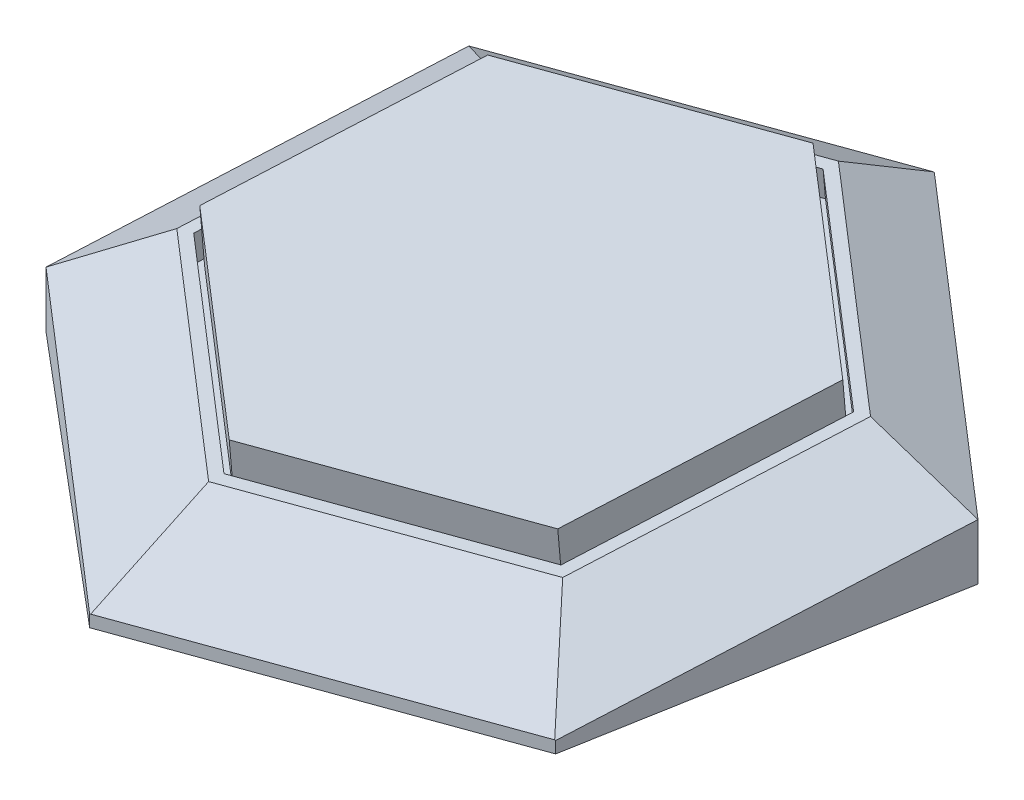
ISO-10303-21;
HEADER;
FILE_DESCRIPTION(('STEP AP214'),'2;1');
FILE_NAME('part.step','',(''),(''),'','','');
FILE_SCHEMA(('AUTOMOTIVE_DESIGN { 1 0 10303 214 1 1 1 1 }'));
ENDSEC;
DATA;
#1=APPLICATION_CONTEXT('core data for automotive mechanical design processes');
#2=APPLICATION_PROTOCOL_DEFINITION('international standard','automotive_design',2000,#1);
#3=PRODUCT_CONTEXT('',#1,'mechanical');
#4=PRODUCT('Part','Part','',(#3));
#5=PRODUCT_RELATED_PRODUCT_CATEGORY('part','',(#4));
#6=PRODUCT_DEFINITION_FORMATION('','',#4);
#7=PRODUCT_DEFINITION_CONTEXT('part definition',#1,'design');
#8=PRODUCT_DEFINITION('design','',#6,#7);
#9=PRODUCT_DEFINITION_SHAPE('','',#8);
#10=(LENGTH_UNIT() NAMED_UNIT(*) SI_UNIT(.MILLI.,.METRE.));
#11=(NAMED_UNIT(*) PLANE_ANGLE_UNIT() SI_UNIT($,.RADIAN.));
#12=(NAMED_UNIT(*) SI_UNIT($,.STERADIAN.) SOLID_ANGLE_UNIT());
#13=UNCERTAINTY_MEASURE_WITH_UNIT(LENGTH_MEASURE(1.E-05),#10,'distance_accuracy_value','');
#14=(GEOMETRIC_REPRESENTATION_CONTEXT(3) GLOBAL_UNCERTAINTY_ASSIGNED_CONTEXT((#13)) GLOBAL_UNIT_ASSIGNED_CONTEXT((#10,
#11,#12)) REPRESENTATION_CONTEXT('',''));
#15=CARTESIAN_POINT('',(0.,0.,0.));
#16=DIRECTION('',(0.,0.,1.));
#17=DIRECTION('',(1.,0.,0.));
#18=AXIS2_PLACEMENT_3D('',#15,#16,#17);
#19=CARTESIAN_POINT('',(1.01675946226807,21.3458509470988,2.8138595291201));
#20=DIRECTION('',(0.0471715385952953,0.990319410998527,0.130546199278579));
#21=DIRECTION('',(0.,-0.130691684821704,0.991423059807701));
#22=AXIS2_PLACEMENT_3D('',#19,#20,#21);
#23=PLANE('',#22);
#24=DIRECTION('',(-0.758976971156788,0.120501210175524,-0.639869842702329));
#25=VECTOR('',#24,1.);
#26=CARTESIAN_POINT('',(6.28894349600142,13.3301489193183,61.7156760565683));
#27=LINE('',#26,#25);
#28=CARTESIAN_POINT('',(6.28894349600142,13.3301489193183,61.7156760565683));
#29=VERTEX_POINT('',#28);
#30=CARTESIAN_POINT('',(-27.6831230585581,18.7238239418272,33.0748849540297));
#31=VERTEX_POINT('',#30);
#32=EDGE_CURVE('E225',#29,#31,#27,.T.);
#33=ORIENTED_EDGE('',*,*,#32,.T.);
#34=DIRECTION('',(-0.940485170338627,0.,0.339834730969518));
#35=VECTOR('',#34,1.);
#36=CARTESIAN_POINT('',(-27.6831230585581,18.7238239418272,33.0748849540297));
#37=LINE('',#36,#35);
#38=CARTESIAN_POINT('',(-70.4786896021807,18.7238239418273,48.5386267563631));
#39=VERTEX_POINT('',#38);
#40=EDGE_CURVE('E228',#31,#39,#37,.T.);
#41=ORIENTED_EDGE('',*,*,#40,.T.);
#42=DIRECTION('',(-0.174655053317376,-0.120501210175521,0.977228259260312));
#43=VECTOR('',#42,1.);
#44=CARTESIAN_POINT('',(-70.4786896021807,18.7238239418273,48.5386267563631));
#45=LINE('',#44,#43);
#46=CARTESIAN_POINT('',(-78.2963090041827,13.3301489193184,92.2796949629368));
#47=VERTEX_POINT('',#46);
#48=EDGE_CURVE('E232',#39,#47,#45,.T.);
#49=ORIENTED_EDGE('',*,*,#48,.T.);
#50=DIRECTION('',(0.758976971156787,-0.120501210175524,0.639869842702329));
#51=VECTOR('',#50,1.);
#52=CARTESIAN_POINT('',(-78.2963090041827,13.3301489193184,92.2796949629368));
#53=LINE('',#52,#51);
#54=CARTESIAN_POINT('',(-44.6526328361873,7.9886117619817,120.643630359728));
#55=VERTEX_POINT('',#54);
#56=EDGE_CURVE('E235',#47,#55,#53,.T.);
#57=ORIENTED_EDGE('',*,*,#56,.T.);
#58=DIRECTION('',(0.940485170338627,0.,-0.339834730969518));
#59=VECTOR('',#58,1.);
#60=CARTESIAN_POINT('',(-44.6526328361873,7.9886117619817,120.643630359728));
#61=LINE('',#60,#59);
#62=CARTESIAN_POINT('',(-1.45310702492267,7.9886117619816,105.033921993145));
#63=VERTEX_POINT('',#62);
#64=EDGE_CURVE('E238',#55,#63,#61,.T.);
#65=ORIENTED_EDGE('',*,*,#64,.T.);
#66=DIRECTION('',(0.174655053317376,0.120501210175521,-0.977228259260312));
#67=VECTOR('',#66,1.);
#68=CARTESIAN_POINT('',(-1.45310702492267,7.9886117619816,105.033921993145));
#69=LINE('',#68,#67);
#70=EDGE_CURVE('E241',#63,#29,#69,.T.);
#71=ORIENTED_EDGE('',*,*,#70,.T.);
#72=EDGE_LOOP('',(#33,#41,#49,#57,#65,#71));
#73=FACE_BOUND('',#72,.T.);
#74=DIRECTION('',(-0.758976971156788,0.120501210175523,-0.639869842702329));
#75=VECTOR('',#74,1.);
#76=CARTESIAN_POINT('',(5.20558342776289,13.3301489193183,62.1071371757271));
#77=LINE('',#76,#75);
#78=CARTESIAN_POINT('',(5.20558342776289,13.3301489193183,62.1071371757271));
#79=VERTEX_POINT('',#78);
#80=CARTESIAN_POINT('',(-27.8922052868092,18.5850166502337,34.2034224868486));
#81=VERTEX_POINT('',#80);
#82=EDGE_CURVE('E635',#79,#81,#77,.T.);
#83=ORIENTED_EDGE('',*,*,#82,.F.);
#84=DIRECTION('',(0.174655053317376,0.120501210175521,-0.977228259260312));
#85=VECTOR('',#84,1.);
#86=CARTESIAN_POINT('',(-2.3352791143949,8.12741905357513,104.299698086079));
#87=LINE('',#86,#85);
#88=CARTESIAN_POINT('',(-2.3352791143949,8.12741905357513,104.299698086079));
#89=VERTEX_POINT('',#88);
#90=EDGE_CURVE('E216',#89,#79,#87,.T.);
#91=ORIENTED_EDGE('',*,*,#90,.F.);
#92=DIRECTION('',(0.940485170338627,0.,-0.339834730969518));
#93=VECTOR('',#92,1.);
#94=CARTESIAN_POINT('',(-44.4435506079362,8.12741905357523,119.515092826909));
#95=LINE('',#94,#93);
#96=CARTESIAN_POINT('',(-44.4435506079362,8.12741905357523,119.515092826909));
#97=VERTEX_POINT('',#96);
#98=EDGE_CURVE('E212',#97,#89,#95,.T.);
#99=ORIENTED_EDGE('',*,*,#98,.F.);
#100=DIRECTION('',(0.758976971156787,-0.120501210175524,0.639869842702329));
#101=VECTOR('',#100,1.);
#102=CARTESIAN_POINT('',(-77.2129489359442,13.3301489193185,91.888233843778));
#103=LINE('',#102,#101);
#104=CARTESIAN_POINT('',(-77.2129489359442,13.3301489193185,91.888233843778));
#105=VERTEX_POINT('',#104);
#106=EDGE_CURVE('E631',#105,#97,#103,.T.);
#107=ORIENTED_EDGE('',*,*,#106,.F.);
#108=DIRECTION('',(-0.174655053317376,-0.120501210175521,0.977228259260312));
#109=VECTOR('',#108,1.);
#110=CARTESIAN_POINT('',(-69.5965175127085,18.5850166502338,49.2728506634293));
#111=LINE('',#110,#109);
#112=CARTESIAN_POINT('',(-69.5965175127085,18.5850166502338,49.2728506634293));
#113=VERTEX_POINT('',#112);
#114=EDGE_CURVE('E643',#113,#105,#111,.T.);
#115=ORIENTED_EDGE('',*,*,#114,.F.);
#116=DIRECTION('',(-0.940485170338627,0.,0.339834730969518));
#117=VECTOR('',#116,1.);
#118=CARTESIAN_POINT('',(-27.8922052868092,18.5850166502337,34.2034224868486));
#119=LINE('',#118,#117);
#120=EDGE_CURVE('E637',#81,#113,#119,.T.);
#121=ORIENTED_EDGE('',*,*,#120,.F.);
#122=EDGE_LOOP('',(#83,#91,#99,#107,#115,#121));
#123=FACE_BOUND('',#122,.T.);
#124=ADVANCED_FACE('F36',(#73,#123),#23,.T.);
#125=CARTESIAN_POINT('',(1.25261715524454,26.2974480020914,3.46659052551318));
#126=DIRECTION('',(0.0471715385952953,0.990319410998527,0.130546199278579));
#127=DIRECTION('',(0.,-0.130691684821704,0.991423059807701));
#128=AXIS2_PLACEMENT_3D('',#125,#126,#127);
#129=PLANE('',#128);
#130=DIRECTION('',(-0.758976971156788,0.120501210175524,-0.639869842702329));
#131=VECTOR('',#130,1.);
#132=CARTESIAN_POINT('',(6.5248011889779,18.2817459743109,62.3684070529612));
#133=LINE('',#132,#131);
#134=CARTESIAN_POINT('',(6.5248011889779,18.2817459743109,62.3684070529612));
#135=VERTEX_POINT('',#134);
#136=CARTESIAN_POINT('',(-27.4472653655817,23.6754209968198,33.7276159504226));
#137=VERTEX_POINT('',#136);
#138=EDGE_CURVE('E62',#135,#137,#133,.T.);
#139=ORIENTED_EDGE('',*,*,#138,.F.);
#140=DIRECTION('',(0.174655053317376,0.120501210175521,-0.977228259260312));
#141=VECTOR('',#140,1.);
#142=CARTESIAN_POINT('',(-1.21724933194619,12.9402088169742,105.686652989538));
#143=LINE('',#142,#141);
#144=CARTESIAN_POINT('',(-1.21724933194619,12.9402088169742,105.686652989538));
#145=VERTEX_POINT('',#144);
#146=EDGE_CURVE('E229',#145,#135,#143,.T.);
#147=ORIENTED_EDGE('',*,*,#146,.F.);
#148=DIRECTION('',(0.940485170338627,0.,-0.339834730969518));
#149=VECTOR('',#148,1.);
#150=CARTESIAN_POINT('',(-44.4167751432108,12.9402088169743,121.296361356121));
#151=LINE('',#150,#149);
#152=CARTESIAN_POINT('',(-44.4167751432108,12.9402088169743,121.296361356121));
#153=VERTEX_POINT('',#152);
#154=EDGE_CURVE('E253',#153,#145,#151,.T.);
#155=ORIENTED_EDGE('',*,*,#154,.F.);
#156=DIRECTION('',(0.758976971156787,-0.120501210175524,0.639869842702329));
#157=VECTOR('',#156,1.);
#158=CARTESIAN_POINT('',(-78.0604513112063,18.2817459743111,92.9324259593297));
#159=LINE('',#158,#157);
#160=CARTESIAN_POINT('',(-78.0604513112063,18.2817459743111,92.9324259593297));
#161=VERTEX_POINT('',#160);
#162=EDGE_CURVE('E250',#161,#153,#159,.T.);
#163=ORIENTED_EDGE('',*,*,#162,.F.);
#164=DIRECTION('',(-0.174655053317376,-0.120501210175521,0.977228259260312));
#165=VECTOR('',#164,1.);
#166=CARTESIAN_POINT('',(-70.2428319092042,23.6754209968199,49.1913577527559));
#167=LINE('',#166,#165);
#168=CARTESIAN_POINT('',(-70.2428319092042,23.6754209968199,49.1913577527559));
#169=VERTEX_POINT('',#168);
#170=EDGE_CURVE('E247',#169,#161,#167,.T.);
#171=ORIENTED_EDGE('',*,*,#170,.F.);
#172=DIRECTION('',(-0.940485170338627,0.,0.339834730969518));
#173=VECTOR('',#172,1.);
#174=CARTESIAN_POINT('',(-27.4472653655817,23.6754209968198,33.7276159504226));
#175=LINE('',#174,#173);
#176=EDGE_CURVE('E219',#137,#169,#175,.T.);
#177=ORIENTED_EDGE('',*,*,#176,.F.);
#178=EDGE_LOOP('',(#139,#147,#155,#163,#171,#177));
#179=FACE_BOUND('',#178,.T.);
#180=DIRECTION('',(-0.940485170338627,0.,0.339834730969518));
#181=VECTOR('',#180,1.);
#182=CARTESIAN_POINT('',(-79.3825536431262,23.953035580007,50.387927448992));
#183=LINE('',#182,#181);
#184=CARTESIAN_POINT('',(-27.0291009090795,23.9530355800069,31.4705408847847));
#185=VERTEX_POINT('',#184);
#186=CARTESIAN_POINT('',(-72.0071760881486,23.953035580007,47.7229099386234));
#187=VERTEX_POINT('',#186);
#188=EDGE_CURVE('E308',#185,#187,#183,.T.);
#189=ORIENTED_EDGE('',*,*,#188,.T.);
#190=DIRECTION('',(-0.174655053317376,-0.120501210175521,0.977228259260312));
#191=VECTOR('',#190,1.);
#192=CARTESIAN_POINT('',(-82.1534793575359,16.9527123740859,104.493407519664));
#193=LINE('',#192,#191);
#194=CARTESIAN_POINT('',(-80.2271714476833,18.2817459743111,93.7153481976471));
#195=VERTEX_POINT('',#194);
#196=EDGE_CURVE('E310',#187,#195,#193,.T.);
#197=ORIENTED_EDGE('',*,*,#196,.T.);
#198=DIRECTION('',(0.758976971156787,-0.120501210175524,0.639869842702329));
#199=VECTOR('',#198,1.);
#200=CARTESIAN_POINT('',(-35.5336964028465,11.1858550125024,131.395024832859));
#201=LINE('',#200,#199);
#202=CARTESIAN_POINT('',(-44.8349395997129,12.6625942337873,123.553436421759));
#203=VERTEX_POINT('',#202);
#204=EDGE_CURVE('E289',#195,#203,#201,.T.);
#205=ORIENTED_EDGE('',*,*,#204,.T.);
#206=DIRECTION('',(0.940485170338627,0.,-0.339834730969518));
#207=VECTOR('',#206,1.);
#208=CARTESIAN_POINT('',(7.72049276815488,12.6625942337872,104.563066575427));
#209=LINE('',#208,#207);
#210=CARTESIAN_POINT('',(0.547094846998261,12.6625942337872,107.155100803671));
#211=VERTEX_POINT('',#210);
#212=EDGE_CURVE('E302',#203,#211,#209,.T.);
#213=ORIENTED_EDGE('',*,*,#212,.T.);
#214=DIRECTION('',(0.174655053317376,0.120501210175521,-0.977228259260312));
#215=VECTOR('',#214,1.);
#216=CARTESIAN_POINT('',(9.58020661658568,18.8948839912902,56.6131214985718));
#217=LINE('',#216,#215);
#218=CARTESIAN_POINT('',(8.69152132545497,18.2817459743109,61.5854848146437));
#219=VERTEX_POINT('',#218);
#220=EDGE_CURVE('E304',#211,#219,#217,.T.);
#221=ORIENTED_EDGE('',*,*,#220,.T.);
#222=DIRECTION('',(-0.758976971156788,0.120501210175524,-0.639869842702329));
#223=VECTOR('',#222,1.);
#224=CARTESIAN_POINT('',(-31.4928848009448,24.6617413528737,27.7072637297589));
#225=LINE('',#224,#223);
#226=EDGE_CURVE('E306',#219,#185,#225,.T.);
#227=ORIENTED_EDGE('',*,*,#226,.T.);
#228=EDGE_LOOP('',(#189,#197,#205,#213,#221,#227));
#229=FACE_BOUND('',#228,.T.);
#230=ADVANCED_FACE('F386',(#179,#229),#129,.T.);
#231=CARTESIAN_POINT('',(-45.7897550663395,80.,143.355261310093));
#232=DIRECTION('',(-0.339834730969518,0.,-0.940485170338627));
#233=DIRECTION('',(-0.940485170338627,0.,0.339834730969518));
#234=AXIS2_PLACEMENT_3D('',#231,#232,#233);
#235=PLANE('',#234);
#236=DIRECTION('',(0.,-1.,0.));
#237=VECTOR('',#236,1.);
#238=CARTESIAN_POINT('',(13.9390752226848,80.,121.772857235517));
#239=LINE('',#238,#237);
#240=CARTESIAN_POINT('',(13.9390752226848,2.03902973123853,121.772857235517));
#241=VERTEX_POINT('',#240);
#242=CARTESIAN_POINT('',(13.9390752226848,0.,121.772857235517));
#243=VERTEX_POINT('',#242);
#244=EDGE_CURVE('E290',#241,#243,#239,.T.);
#245=ORIENTED_EDGE('',*,*,#244,.F.);
#246=DIRECTION('',(-0.859893785648814,0.405017996400494,0.310713855491319));
#247=VECTOR('',#246,1.);
#248=CARTESIAN_POINT('',(40.1471587044077,-10.3052221268618,112.302833379605));
#249=LINE('',#248,#247);
#250=CARTESIAN_POINT('',(13.8144015618452,2.09775218877911,121.817906792199));
#251=VERTEX_POINT('',#250);
#252=EDGE_CURVE('E46',#241,#251,#249,.T.);
#253=ORIENTED_EDGE('',*,*,#252,.T.);
#254=DIRECTION('',(-0.940485170338627,0.,0.339834730969518));
#255=VECTOR('',#254,1.);
#256=CARTESIAN_POINT('',(-45.7897550663395,2.09775218877926,143.355261310093));
#257=LINE('',#256,#255);
#258=CARTESIAN_POINT('',(-45.6650814054999,2.09775218877926,143.31021175341));
#259=VERTEX_POINT('',#258);
#260=EDGE_CURVE('E328',#251,#259,#257,.T.);
#261=ORIENTED_EDGE('',*,*,#260,.T.);
#262=DIRECTION('',(-0.859893785648815,-0.405017996400492,0.31071385549132));
#263=VECTOR('',#262,1.);
#264=CARTESIAN_POINT('',(-51.2442798115745,-0.53010231797725,145.326198234804));
#265=LINE('',#264,#263);
#266=CARTESIAN_POINT('',(-45.7897550663395,2.0390297312387,143.355261310093));
#267=VERTEX_POINT('',#266);
#268=EDGE_CURVE('E326',#259,#267,#265,.T.);
#269=ORIENTED_EDGE('',*,*,#268,.T.);
#270=DIRECTION('',(0.,-1.,0.));
#271=VECTOR('',#270,1.);
#272=CARTESIAN_POINT('',(-45.7897550663395,80.,143.355261310093));
#273=LINE('',#272,#271);
#274=CARTESIAN_POINT('',(-45.7897550663395,0.,143.355261310093));
#275=VERTEX_POINT('',#274);
#276=EDGE_CURVE('E274',#267,#275,#273,.T.);
#277=ORIENTED_EDGE('',*,*,#276,.T.);
#278=DIRECTION('',(0.940485170338626,0.,-0.339834730969518));
#279=VECTOR('',#278,1.);
#280=CARTESIAN_POINT('',(-45.7897550663395,0.,143.355261310093));
#281=LINE('',#280,#279);
#282=EDGE_CURVE('E286',#275,#243,#281,.T.);
#283=ORIENTED_EDGE('',*,*,#282,.T.);
#284=EDGE_LOOP('',(#245,#253,#261,#269,#277,#283));
#285=FACE_BOUND('',#284,.T.);
#286=ADVANCED_FACE('F364',(#285),#235,.F.);
#287=CARTESIAN_POINT('',(13.9390752226848,80.,121.772857235517));
#288=DIRECTION('',(-0.984401414880545,0.,-0.17593707506146));
#289=DIRECTION('',(-0.17593707506146,0.,0.984401414880545));
#290=AXIS2_PLACEMENT_3D('',#287,#288,#289);
#291=PLANE('',#290);
#292=DIRECTION('',(0.,-1.,0.));
#293=VECTOR('',#292,1.);
#294=CARTESIAN_POINT('',(25.1125801638735,80.,59.2549708296043));
#295=LINE('',#294,#293);
#296=CARTESIAN_POINT('',(25.1125801638735,9.74805871002646,59.2549708296043));
#297=VERTEX_POINT('',#296);
#298=CARTESIAN_POINT('',(25.1125801638735,0.,59.2549708296043));
#299=VERTEX_POINT('',#298);
#300=EDGE_CURVE('E292',#297,#299,#295,.T.);
#301=ORIENTED_EDGE('',*,*,#300,.F.);
#302=DIRECTION('',(-0.174655053317376,-0.120501210175521,0.977228259260312));
#303=VECTOR('',#302,1.);
#304=CARTESIAN_POINT('',(14.108680266362,2.15604674635938,120.823884741184));
#305=LINE('',#304,#303);
#306=EDGE_CURVE('E324',#297,#241,#305,.T.);
#307=ORIENTED_EDGE('',*,*,#306,.T.);
#308=ORIENTED_EDGE('',*,*,#244,.T.);
#309=DIRECTION('',(0.17593707506146,0.,-0.984401414880545));
#310=VECTOR('',#309,1.);
#311=CARTESIAN_POINT('',(13.9390752226848,0.,121.772857235517));
#312=LINE('',#311,#310);
#313=EDGE_CURVE('E283',#243,#299,#312,.T.);
#314=ORIENTED_EDGE('',*,*,#313,.T.);
#315=EDGE_LOOP('',(#301,#307,#308,#314));
#316=FACE_BOUND('',#315,.T.);
#317=ADVANCED_FACE('F361',(#316),#291,.F.);
#318=CARTESIAN_POINT('',(25.1125801638735,80.,59.2549708296043));
#319=DIRECTION('',(-0.644566683911026,0.,0.764548095277166));
#320=DIRECTION('',(0.764548095277166,0.,0.644566683911026));
#321=AXIS2_PLACEMENT_3D('',#318,#319,#320);
#322=PLANE('',#321);
#323=DIRECTION('',(0.,-1.,0.));
#324=VECTOR('',#323,1.);
#325=CARTESIAN_POINT('',(-23.4427451839622,80.,18.3194884982677));
#326=LINE('',#325,#324);
#327=CARTESIAN_POINT('',(-23.4427451839622,17.4570876888145,18.3194884982677));
#328=VERTEX_POINT('',#327);
#329=CARTESIAN_POINT('',(-23.4427451839622,0.,18.3194884982677));
#330=VERTEX_POINT('',#329);
#331=EDGE_CURVE('E294',#328,#330,#326,.T.);
#332=ORIENTED_EDGE('',*,*,#331,.F.);
#333=DIRECTION('',(0.758976971156788,-0.120501210175524,0.639869842702329));
#334=VECTOR('',#333,1.);
#335=CARTESIAN_POINT('',(24.3755483981272,9.86507572514731,58.6336023060034));
#336=LINE('',#335,#334);
#337=EDGE_CURVE('E322',#328,#297,#336,.T.);
#338=ORIENTED_EDGE('',*,*,#337,.T.);
#339=ORIENTED_EDGE('',*,*,#300,.T.);
#340=DIRECTION('',(-0.764548095277166,0.,-0.644566683911026));
#341=VECTOR('',#340,1.);
#342=CARTESIAN_POINT('',(25.1125801638735,0.,59.2549708296043));
#343=LINE('',#342,#341);
#344=EDGE_CURVE('E280',#299,#330,#343,.T.);
#345=ORIENTED_EDGE('',*,*,#344,.T.);
#346=EDGE_LOOP('',(#332,#338,#339,#345));
#347=FACE_BOUND('',#346,.T.);
#348=ADVANCED_FACE('F375',(#347),#322,.F.);
#349=CARTESIAN_POINT('',(-23.4427451839622,80.,18.3194884982677));
#350=DIRECTION('',(0.339834730969518,0.,0.940485170338627));
#351=DIRECTION('',(0.940485170338627,0.,-0.339834730969518));
#352=AXIS2_PLACEMENT_3D('',#349,#350,#351);
#353=PLANE('',#352);
#354=DIRECTION('',(0.,-1.,0.));
#355=VECTOR('',#354,1.);
#356=CARTESIAN_POINT('',(-83.1715754729864,80.,39.9018925728436));
#357=LINE('',#356,#355);
#358=CARTESIAN_POINT('',(-83.1715754729864,17.4570876888146,39.9018925728436));
#359=VERTEX_POINT('',#358);
#360=CARTESIAN_POINT('',(-83.1715754729864,0.,39.9018925728436));
#361=VERTEX_POINT('',#360);
#362=EDGE_CURVE('E296',#359,#361,#357,.T.);
#363=ORIENTED_EDGE('',*,*,#362,.F.);
#364=DIRECTION('',(0.81905102887157,0.491493246262087,-0.295955741595222));
#365=VECTOR('',#364,1.);
#366=CARTESIAN_POINT('',(-52.2882647085829,35.9894356474394,28.7425229877918));
#367=LINE('',#366,#365);
#368=CARTESIAN_POINT('',(-83.0737171816827,17.5158101463553,39.8665324766431));
#369=VERTEX_POINT('',#368);
#370=EDGE_CURVE('E320',#359,#369,#367,.T.);
#371=ORIENTED_EDGE('',*,*,#370,.T.);
#372=DIRECTION('',(0.940485170338627,0.,-0.339834730969518));
#373=VECTOR('',#372,1.);
#374=CARTESIAN_POINT('',(-23.4427451839622,17.5158101463551,18.3194884982678));
#375=LINE('',#374,#373);
#376=CARTESIAN_POINT('',(-23.5406034752658,17.5158101463551,18.3548485944682));
#377=VERTEX_POINT('',#376);
#378=EDGE_CURVE('E318',#369,#377,#375,.T.);
#379=ORIENTED_EDGE('',*,*,#378,.T.);
#380=DIRECTION('',(0.819051028871569,-0.491493246262089,-0.295955741595221));
#381=VECTOR('',#380,1.);
#382=CARTESIAN_POINT('',(-30.3376183925423,21.5945388321449,20.8108806603187));
#383=LINE('',#382,#381);
#384=EDGE_CURVE('E316',#377,#328,#383,.T.);
#385=ORIENTED_EDGE('',*,*,#384,.T.);
#386=ORIENTED_EDGE('',*,*,#331,.T.);
#387=DIRECTION('',(-0.940485170338627,0.,0.339834730969518));
#388=VECTOR('',#387,1.);
#389=CARTESIAN_POINT('',(-23.4427451839622,0.,18.3194884982677));
#390=LINE('',#389,#388);
#391=EDGE_CURVE('E277',#330,#361,#390,.T.);
#392=ORIENTED_EDGE('',*,*,#391,.T.);
#393=EDGE_LOOP('',(#363,#371,#379,#385,#386,#392));
#394=FACE_BOUND('',#393,.T.);
#395=ADVANCED_FACE('F378',(#394),#353,.F.);
#396=CARTESIAN_POINT('',(-83.1715754729864,80.,39.9018925728436));
#397=DIRECTION('',(0.984401414880545,0.,0.175937075061461));
#398=DIRECTION('',(0.175937075061461,0.,-0.984401414880545));
#399=AXIS2_PLACEMENT_3D('',#396,#397,#398);
#400=PLANE('',#399);
#401=DIRECTION('',(0.,-1.,0.));
#402=VECTOR('',#401,1.);
#403=CARTESIAN_POINT('',(-94.3450804141751,80.,102.419778978756));
#404=LINE('',#403,#402);
#405=CARTESIAN_POINT('',(-94.3450804141751,9.74805871002677,102.419778978756));
#406=VERTEX_POINT('',#405);
#407=CARTESIAN_POINT('',(-94.3450804141751,0.,102.419778978756));
#408=VERTEX_POINT('',#407);
#409=EDGE_CURVE('E298',#406,#408,#404,.T.);
#410=ORIENTED_EDGE('',*,*,#409,.F.);
#411=DIRECTION('',(0.174655053317376,0.120501210175521,-0.977228259260312));
#412=VECTOR('',#411,1.);
#413=CARTESIAN_POINT('',(-83.0019704293093,17.5741047039355,38.9529200785108));
#414=LINE('',#413,#412);
#415=EDGE_CURVE('E313',#406,#359,#414,.T.);
#416=ORIENTED_EDGE('',*,*,#415,.T.);
#417=ORIENTED_EDGE('',*,*,#362,.T.);
#418=DIRECTION('',(-0.175937075061461,0.,0.984401414880545));
#419=VECTOR('',#418,1.);
#420=CARTESIAN_POINT('',(-83.1715754729864,0.,39.9018925728436));
#421=LINE('',#420,#419);
#422=EDGE_CURVE('E273',#361,#408,#421,.T.);
#423=ORIENTED_EDGE('',*,*,#422,.T.);
#424=EDGE_LOOP('',(#410,#416,#417,#423));
#425=FACE_BOUND('',#424,.T.);
#426=ADVANCED_FACE('F400',(#425),#400,.F.);
#427=CARTESIAN_POINT('',(-94.3450804141751,80.,102.419778978756));
#428=DIRECTION('',(0.644566683911027,0.,-0.764548095277166));
#429=DIRECTION('',(-0.764548095277166,0.,-0.644566683911027));
#430=AXIS2_PLACEMENT_3D('',#427,#428,#429);
#431=PLANE('',#430);
#432=ORIENTED_EDGE('',*,*,#276,.F.);
#433=DIRECTION('',(-0.758976971156787,0.120501210175524,-0.639869842702329));
#434=VECTOR('',#433,1.);
#435=CARTESIAN_POINT('',(-95.0821121799214,9.86507572514762,101.798410455155));
#436=LINE('',#435,#434);
#437=EDGE_CURVE('E12',#267,#406,#436,.T.);
#438=ORIENTED_EDGE('',*,*,#437,.T.);
#439=ORIENTED_EDGE('',*,*,#409,.T.);
#440=DIRECTION('',(0.764548095277166,0.,0.644566683911027));
#441=VECTOR('',#440,1.);
#442=CARTESIAN_POINT('',(-94.3450804141751,0.,102.419778978756));
#443=LINE('',#442,#441);
#444=EDGE_CURVE('E270',#408,#275,#443,.T.);
#445=ORIENTED_EDGE('',*,*,#444,.T.);
#446=EDGE_LOOP('',(#432,#438,#439,#445));
#447=FACE_BOUND('',#446,.T.);
#448=ADVANCED_FACE('F396',(#447),#431,.F.);
#449=CARTESIAN_POINT('',(0.,0.,0.));
#450=DIRECTION('',(0.,1.,0.));
#451=DIRECTION('',(0.,0.,1.));
#452=AXIS2_PLACEMENT_3D('',#449,#450,#451);
#453=PLANE('',#452);
#454=ORIENTED_EDGE('',*,*,#282,.F.);
#455=ORIENTED_EDGE('',*,*,#444,.F.);
#456=ORIENTED_EDGE('',*,*,#422,.F.);
#457=ORIENTED_EDGE('',*,*,#391,.F.);
#458=ORIENTED_EDGE('',*,*,#344,.F.);
#459=ORIENTED_EDGE('',*,*,#313,.F.);
#460=EDGE_LOOP('',(#454,#455,#456,#457,#458,#459));
#461=FACE_BOUND('',#460,.T.);
#462=ADVANCED_FACE('F369',(#461),#453,.F.);
#463=CARTESIAN_POINT('',(18.5529098765245,25.085495604478,6.40913930038222));
#464=DIRECTION('',(0.473840422885973,0.859714832813576,0.190697823478842));
#465=DIRECTION('',(-0.174655053317376,-0.120501210175521,0.977228259260312));
#466=AXIS2_PLACEMENT_3D('',#463,#464,#465);
#467=PLANE('',#466);
#468=ORIENTED_EDGE('',*,*,#252,.F.);
#469=ORIENTED_EDGE('',*,*,#306,.F.);
#470=DIRECTION('',(-0.880379697436472,0.457515260475844,0.124945487206969));
#471=VECTOR('',#470,1.);
#472=CARTESIAN_POINT('',(19.6636779622562,12.5797413548437,60.0282914119696));
#473=LINE('',#472,#471);
#474=EDGE_CURVE('E41',#219,#297,#473,.F.);
#475=ORIENTED_EDGE('',*,*,#474,.F.);
#476=ORIENTED_EDGE('',*,*,#220,.F.);
#477=DIRECTION('',(-0.591774602079909,0.471233938552529,-0.654019415223612));
#478=VECTOR('',#477,1.);
#479=CARTESIAN_POINT('',(7.64922822357179,7.00711954561158,115.004260097532));
#480=LINE('',#479,#478);
#481=EDGE_CURVE('E340',#251,#211,#480,.T.);
#482=ORIENTED_EDGE('',*,*,#481,.F.);
#483=EDGE_LOOP('',(#468,#469,#475,#476,#482));
#484=FACE_BOUND('',#483,.T.);
#485=ADVANCED_FACE('F39',(#484),#467,.T.);
#486=CARTESIAN_POINT('',(-24.5519633538422,23.5597455534039,33.5589383962479));
#487=DIRECTION('',(0.402069371022066,0.859714832813575,-0.315008931819792));
#488=DIRECTION('',(0.758976971156788,-0.120501210175524,0.639869842702329));
#489=AXIS2_PLACEMENT_3D('',#486,#487,#488);
#490=PLANE('',#489);
#491=ORIENTED_EDGE('',*,*,#337,.F.);
#492=ORIENTED_EDGE('',*,*,#384,.F.);
#493=DIRECTION('',(-0.23224216626588,0.428549886539189,0.873160106140552));
#494=VECTOR('',#493,1.);
#495=CARTESIAN_POINT('',(-27.279844695021,24.4157259809078,32.4132614693669));
#496=LINE('',#495,#494);
#497=EDGE_CURVE('E338',#185,#377,#496,.F.);
#498=ORIENTED_EDGE('',*,*,#497,.F.);
#499=ORIENTED_EDGE('',*,*,#226,.F.);
#500=ORIENTED_EDGE('',*,*,#474,.T.);
#501=EDGE_LOOP('',(#491,#492,#498,#499,#500));
#502=FACE_BOUND('',#501,.T.);
#503=ADVANCED_FACE('F351',(#502),#490,.T.);
#504=CARTESIAN_POINT('',(34.3109735474772,12.6625942337871,94.9548673533831));
#505=DIRECTION('',(0.169917365484761,0.866025403784438,0.470242585169314));
#506=DIRECTION('',(-0.940485170338627,0.,0.339834730969518));
#507=AXIS2_PLACEMENT_3D('',#504,#505,#506);
#508=PLANE('',#507);
#509=ORIENTED_EDGE('',*,*,#481,.T.);
#510=ORIENTED_EDGE('',*,*,#212,.F.);
#511=DIRECTION('',(0.0370276234165696,0.471233938552529,-0.881230690716337));
#512=VECTOR('',#511,1.);
#513=CARTESIAN_POINT('',(-43.8804333658763,24.8101665174159,100.836877536144));
#514=LINE('',#513,#512);
#515=EDGE_CURVE('E335',#259,#203,#514,.T.);
#516=ORIENTED_EDGE('',*,*,#515,.F.);
#517=ORIENTED_EDGE('',*,*,#260,.F.);
#518=EDGE_LOOP('',(#509,#510,#516,#517));
#519=FACE_BOUND('',#518,.T.);
#520=ADVANCED_FACE('F389',(#519),#508,.T.);
#521=CARTESIAN_POINT('',(6.93675742522039,23.9530355800068,19.1973241523725));
#522=DIRECTION('',(-0.169917365484758,0.866025403784437,-0.470242585169316));
#523=DIRECTION('',(0.940485170338627,0.,-0.339834730969518));
#524=AXIS2_PLACEMENT_3D('',#521,#522,#523);
#525=PLANE('',#524);
#526=ORIENTED_EDGE('',*,*,#497,.T.);
#527=ORIENTED_EDGE('',*,*,#378,.F.);
#528=DIRECTION('',(0.736740538124188,0.428549886539188,0.523028081685612));
#529=VECTOR('',#528,1.);
#530=CARTESIAN_POINT('',(-40.1494000556303,42.4841813465852,70.3394358698316));
#531=LINE('',#530,#529);
#532=EDGE_CURVE('E332',#187,#369,#531,.F.);
#533=ORIENTED_EDGE('',*,*,#532,.F.);
#534=ORIENTED_EDGE('',*,*,#188,.F.);
#535=EDGE_LOOP('',(#526,#527,#533,#534));
#536=FACE_BOUND('',#535,.T.);
#537=ADVANCED_FACE('F382',(#536),#525,.T.);
#538=CARTESIAN_POINT('',(-77.853149927805,17.9048274682172,95.7168117917022));
#539=DIRECTION('',(-0.242497312888962,0.859714832813576,0.449539163457376));
#540=DIRECTION('',(-0.758976971156787,0.120501210175524,-0.639869842702329));
#541=AXIS2_PLACEMENT_3D('',#538,#539,#540);
#542=PLANE('',#541);
#543=ORIENTED_EDGE('',*,*,#515,.T.);
#544=ORIENTED_EDGE('',*,*,#204,.F.);
#545=DIRECTION('',(-0.756901278209704,-0.457515260475843,0.466669306336124));
#546=VECTOR('',#545,1.);
#547=CARTESIAN_POINT('',(-79.704582336629,18.5976293003789,93.3931446223917));
#548=LINE('',#547,#546);
#549=EDGE_CURVE('E260',#406,#195,#548,.F.);
#550=ORIENTED_EDGE('',*,*,#549,.F.);
#551=ORIENTED_EDGE('',*,*,#437,.F.);
#552=ORIENTED_EDGE('',*,*,#268,.F.);
#553=EDGE_LOOP('',(#543,#544,#550,#551,#552));
#554=FACE_BOUND('',#553,.T.);
#555=ADVANCED_FACE('F392',(#554),#542,.T.);
#556=CARTESIAN_POINT('',(-62.1695165003255,30.740413689665,-7.3206675107757));
#557=DIRECTION('',(-0.510560991994574,0.859714832813576,0.0147607484173816));
#558=DIRECTION('',(0.174655053317376,0.120501210175521,-0.977228259260312));
#559=AXIS2_PLACEMENT_3D('',#556,#557,#558);
#560=PLANE('',#559);
#561=ORIENTED_EDGE('',*,*,#370,.F.);
#562=ORIENTED_EDGE('',*,*,#415,.F.);
#563=ORIENTED_EDGE('',*,*,#549,.T.);
#564=ORIENTED_EDGE('',*,*,#196,.F.);
#565=ORIENTED_EDGE('',*,*,#532,.T.);
#566=EDGE_LOOP('',(#561,#562,#563,#564,#565));
#567=FACE_BOUND('',#566,.T.);
#568=ADVANCED_FACE('F402',(#567),#560,.T.);
#569=CARTESIAN_POINT('',(6.28894349600142,13.3301489193183,61.7156760565683));
#570=DIRECTION('',(0.649406500737574,0.0688979139434883,-0.757313854524011));
#571=DIRECTION('',(-0.75911773433395,0.,-0.650953351185544));
#572=AXIS2_PLACEMENT_3D('',#569,#570,#571);
#573=PLANE('',#572);
#574=ORIENTED_EDGE('',*,*,#138,.T.);
#575=DIRECTION('',(0.0471715385952953,0.990319410998527,0.130546199278579));
#576=VECTOR('',#575,1.);
#577=CARTESIAN_POINT('',(-27.6831230585581,18.7238239418272,33.0748849540297));
#578=LINE('',#577,#576);
#579=EDGE_CURVE('E243',#31,#137,#578,.T.);
#580=ORIENTED_EDGE('',*,*,#579,.F.);
#581=ORIENTED_EDGE('',*,*,#32,.F.);
#582=DIRECTION('',(0.0471715385952953,0.990319410998527,0.130546199278579));
#583=VECTOR('',#582,1.);
#584=CARTESIAN_POINT('',(6.28894349600142,13.3301489193183,61.7156760565683));
#585=LINE('',#584,#583);
#586=EDGE_CURVE('E258',#29,#135,#585,.T.);
#587=ORIENTED_EDGE('',*,*,#586,.T.);
#588=EDGE_LOOP('',(#574,#580,#581,#587));
#589=FACE_BOUND('',#588,.T.);
#590=ADVANCED_FACE('F404',(#589),#573,.F.);
#591=CARTESIAN_POINT('',(-1.45310702492267,7.9886117619816,105.033921993145));
#592=DIRECTION('',(0.983499089118672,-0.0688979139434921,0.167280062042606));
#593=DIRECTION('',(0.167678513919224,0.,-0.985841729675631));
#594=AXIS2_PLACEMENT_3D('',#591,#592,#593);
#595=PLANE('',#594);
#596=ORIENTED_EDGE('',*,*,#146,.T.);
#597=ORIENTED_EDGE('',*,*,#586,.F.);
#598=ORIENTED_EDGE('',*,*,#70,.F.);
#599=DIRECTION('',(0.0471715385952953,0.990319410998527,0.130546199278579));
#600=VECTOR('',#599,1.);
#601=CARTESIAN_POINT('',(-1.45310702492267,7.9886117619816,105.033921993145));
#602=LINE('',#601,#600);
#603=EDGE_CURVE('E261',#63,#145,#602,.T.);
#604=ORIENTED_EDGE('',*,*,#603,.T.);
#605=EDGE_LOOP('',(#596,#597,#598,#604));
#606=FACE_BOUND('',#605,.T.);
#607=ADVANCED_FACE('F410',(#606),#595,.F.);
#608=CARTESIAN_POINT('',(-44.6526328361873,7.9886117619817,120.643630359728));
#609=DIRECTION('',(0.336544930610576,-0.138807291593526,0.931380719942598));
#610=DIRECTION('',(0.940485170338627,0.,-0.339834730969518));
#611=AXIS2_PLACEMENT_3D('',#608,#609,#610);
#612=PLANE('',#611);
#613=ORIENTED_EDGE('',*,*,#154,.T.);
#614=ORIENTED_EDGE('',*,*,#603,.F.);
#615=ORIENTED_EDGE('',*,*,#64,.F.);
#616=DIRECTION('',(0.0471715385952953,0.990319410998527,0.130546199278579));
#617=VECTOR('',#616,1.);
#618=CARTESIAN_POINT('',(-44.6526328361873,7.9886117619817,120.643630359728));
#619=LINE('',#618,#617);
#620=EDGE_CURVE('E263',#55,#153,#619,.T.);
#621=ORIENTED_EDGE('',*,*,#620,.T.);
#622=EDGE_LOOP('',(#613,#614,#615,#621));
#623=FACE_BOUND('',#622,.T.);
#624=ADVANCED_FACE('F520',(#623),#612,.F.);
#625=CARTESIAN_POINT('',(-78.2963090041827,13.3301489193184,92.2796949629368));
#626=DIRECTION('',(-0.649406500737575,-0.0688979139434882,0.75731385452401));
#627=DIRECTION('',(0.75911773433395,0.,0.650953351185544));
#628=AXIS2_PLACEMENT_3D('',#625,#626,#627);
#629=PLANE('',#628);
#630=ORIENTED_EDGE('',*,*,#162,.T.);
#631=ORIENTED_EDGE('',*,*,#620,.F.);
#632=ORIENTED_EDGE('',*,*,#56,.F.);
#633=DIRECTION('',(0.0471715385952953,0.990319410998527,0.130546199278579));
#634=VECTOR('',#633,1.);
#635=CARTESIAN_POINT('',(-78.2963090041827,13.3301489193184,92.2796949629368));
#636=LINE('',#635,#634);
#637=EDGE_CURVE('E265',#47,#161,#636,.T.);
#638=ORIENTED_EDGE('',*,*,#637,.T.);
#639=EDGE_LOOP('',(#630,#631,#632,#638));
#640=FACE_BOUND('',#639,.T.);
#641=ADVANCED_FACE('F529',(#640),#629,.F.);
#642=CARTESIAN_POINT('',(-70.4786896021807,18.7238239418273,48.5386267563631));
#643=DIRECTION('',(-0.983499089118672,0.0688979139434922,-0.167280062042606));
#644=DIRECTION('',(-0.167678513919224,0.,0.985841729675631));
#645=AXIS2_PLACEMENT_3D('',#642,#643,#644);
#646=PLANE('',#645);
#647=ORIENTED_EDGE('',*,*,#170,.T.);
#648=ORIENTED_EDGE('',*,*,#637,.F.);
#649=ORIENTED_EDGE('',*,*,#48,.F.);
#650=DIRECTION('',(0.0471715385952953,0.990319410998527,0.130546199278579));
#651=VECTOR('',#650,1.);
#652=CARTESIAN_POINT('',(-70.4786896021807,18.7238239418273,48.5386267563631));
#653=LINE('',#652,#651);
#654=EDGE_CURVE('E267',#39,#169,#653,.T.);
#655=ORIENTED_EDGE('',*,*,#654,.T.);
#656=EDGE_LOOP('',(#647,#648,#649,#655));
#657=FACE_BOUND('',#656,.T.);
#658=ADVANCED_FACE('F539',(#657),#646,.F.);
#659=CARTESIAN_POINT('',(-27.6831230585581,18.7238239418272,33.0748849540297));
#660=DIRECTION('',(-0.336544930610575,0.138807291593526,-0.931380719942599));
#661=DIRECTION('',(-0.940485170338627,0.,0.339834730969517));
#662=AXIS2_PLACEMENT_3D('',#659,#660,#661);
#663=PLANE('',#662);
#664=ORIENTED_EDGE('',*,*,#176,.T.);
#665=ORIENTED_EDGE('',*,*,#654,.F.);
#666=ORIENTED_EDGE('',*,*,#40,.F.);
#667=ORIENTED_EDGE('',*,*,#579,.T.);
#668=EDGE_LOOP('',(#664,#665,#666,#667));
#669=FACE_BOUND('',#668,.T.);
#670=ADVANCED_FACE('F549',(#669),#663,.F.);
#671=CARTESIAN_POINT('',(-1.86356372844195,18.0306131635604,105.605160078865));
#672=DIRECTION('',(-0.983499089118672,0.0688979139434921,-0.167280062042606));
#673=DIRECTION('',(-0.167678513919224,0.,0.985841729675631));
#674=AXIS2_PLACEMENT_3D('',#671,#672,#673);
#675=PLANE('',#674);
#676=ORIENTED_EDGE('',*,*,#90,.T.);
#677=DIRECTION('',(-0.0471715385952953,-0.990319410998527,-0.130546199278579));
#678=VECTOR('',#677,1.);
#679=CARTESIAN_POINT('',(5.67729881371584,23.2333430293035,63.4125991685129));
#680=LINE('',#679,#678);
#681=CARTESIAN_POINT('',(5.67729881371584,23.2333430293035,63.4125991685129));
#682=VERTEX_POINT('',#681);
#683=EDGE_CURVE('E197',#682,#79,#680,.T.);
#684=ORIENTED_EDGE('',*,*,#683,.F.);
#685=DIRECTION('',(0.174655053317376,0.120501210175521,-0.977228259260312));
#686=VECTOR('',#685,1.);
#687=CARTESIAN_POINT('',(-1.86356372844195,18.0306131635604,105.605160078865));
#688=LINE('',#687,#686);
#689=CARTESIAN_POINT('',(-1.86356372844195,18.0306131635604,105.605160078865));
#690=VERTEX_POINT('',#689);
#691=EDGE_CURVE('E204',#690,#682,#688,.T.);
#692=ORIENTED_EDGE('',*,*,#691,.F.);
#693=DIRECTION('',(-0.0471715385952953,-0.990319410998527,-0.130546199278579));
#694=VECTOR('',#693,1.);
#695=CARTESIAN_POINT('',(-1.86356372844195,18.0306131635604,105.605160078865));
#696=LINE('',#695,#694);
#697=EDGE_CURVE('E629',#690,#89,#696,.T.);
#698=ORIENTED_EDGE('',*,*,#697,.T.);
#699=EDGE_LOOP('',(#676,#684,#692,#698));
#700=FACE_BOUND('',#699,.T.);
#701=ADVANCED_FACE('F214',(#700),#675,.F.);
#702=CARTESIAN_POINT('',(5.67729881371584,23.2333430293035,63.4125991685129));
#703=DIRECTION('',(-0.649406500737574,-0.0688979139434883,0.757313854524011));
#704=DIRECTION('',(0.75911773433395,0.,0.650953351185544));
#705=AXIS2_PLACEMENT_3D('',#702,#703,#704);
#706=PLANE('',#705);
#707=ORIENTED_EDGE('',*,*,#82,.T.);
#708=DIRECTION('',(-0.0471715385952953,-0.990319410998527,-0.130546199278579));
#709=VECTOR('',#708,1.);
#710=CARTESIAN_POINT('',(-27.4204899008563,28.488210760219,35.5088844796344));
#711=LINE('',#710,#709);
#712=CARTESIAN_POINT('',(-27.4204899008563,28.488210760219,35.5088844796344));
#713=VERTEX_POINT('',#712);
#714=EDGE_CURVE('E200',#713,#81,#711,.T.);
#715=ORIENTED_EDGE('',*,*,#714,.F.);
#716=DIRECTION('',(-0.758976971156788,0.120501210175523,-0.639869842702329));
#717=VECTOR('',#716,1.);
#718=CARTESIAN_POINT('',(5.67729881371584,23.2333430293035,63.4125991685129));
#719=LINE('',#718,#717);
#720=EDGE_CURVE('E193',#682,#713,#719,.T.);
#721=ORIENTED_EDGE('',*,*,#720,.F.);
#722=ORIENTED_EDGE('',*,*,#683,.T.);
#723=EDGE_LOOP('',(#707,#715,#721,#722));
#724=FACE_BOUND('',#723,.T.);
#725=ADVANCED_FACE('F195',(#724),#706,.F.);
#726=CARTESIAN_POINT('',(-27.4204899008563,28.488210760219,35.5088844796344));
#727=DIRECTION('',(0.336544930610575,-0.138807291593526,0.931380719942599));
#728=DIRECTION('',(0.940485170338627,0.,-0.339834730969517));
#729=AXIS2_PLACEMENT_3D('',#726,#727,#728);
#730=PLANE('',#729);
#731=ORIENTED_EDGE('',*,*,#120,.T.);
#732=DIRECTION('',(-0.0471715385952953,-0.990319410998527,-0.130546199278579));
#733=VECTOR('',#732,1.);
#734=CARTESIAN_POINT('',(-69.1248021267555,28.4882107602191,50.5783126562151));
#735=LINE('',#734,#733);
#736=CARTESIAN_POINT('',(-69.1248021267555,28.4882107602191,50.5783126562151));
#737=VERTEX_POINT('',#736);
#738=EDGE_CURVE('E221',#737,#113,#735,.T.);
#739=ORIENTED_EDGE('',*,*,#738,.F.);
#740=DIRECTION('',(-0.940485170338627,0.,0.339834730969518));
#741=VECTOR('',#740,1.);
#742=CARTESIAN_POINT('',(-27.4204899008563,28.488210760219,35.5088844796344));
#743=LINE('',#742,#741);
#744=EDGE_CURVE('E203',#713,#737,#743,.T.);
#745=ORIENTED_EDGE('',*,*,#744,.F.);
#746=ORIENTED_EDGE('',*,*,#714,.T.);
#747=EDGE_LOOP('',(#731,#739,#745,#746));
#748=FACE_BOUND('',#747,.T.);
#749=ADVANCED_FACE('F578',(#748),#730,.F.);
#750=CARTESIAN_POINT('',(-69.1248021267555,28.4882107602191,50.5783126562151));
#751=DIRECTION('',(0.983499089118672,-0.0688979139434921,0.167280062042606));
#752=DIRECTION('',(0.167678513919224,0.,-0.985841729675631));
#753=AXIS2_PLACEMENT_3D('',#750,#751,#752);
#754=PLANE('',#753);
#755=ORIENTED_EDGE('',*,*,#114,.T.);
#756=DIRECTION('',(-0.0471715385952953,-0.990319410998527,-0.130546199278579));
#757=VECTOR('',#756,1.);
#758=CARTESIAN_POINT('',(-76.7412335499913,23.2333430293037,93.1936958365638));
#759=LINE('',#758,#757);
#760=CARTESIAN_POINT('',(-76.7412335499913,23.2333430293037,93.1936958365638));
#761=VERTEX_POINT('',#760);
#762=EDGE_CURVE('E647',#761,#105,#759,.T.);
#763=ORIENTED_EDGE('',*,*,#762,.F.);
#764=DIRECTION('',(-0.174655053317376,-0.120501210175521,0.977228259260312));
#765=VECTOR('',#764,1.);
#766=CARTESIAN_POINT('',(-69.1248021267555,28.4882107602191,50.5783126562151));
#767=LINE('',#766,#765);
#768=EDGE_CURVE('E654',#737,#761,#767,.T.);
#769=ORIENTED_EDGE('',*,*,#768,.F.);
#770=ORIENTED_EDGE('',*,*,#738,.T.);
#771=EDGE_LOOP('',(#755,#763,#769,#770));
#772=FACE_BOUND('',#771,.T.);
#773=ADVANCED_FACE('F587',(#772),#754,.F.);
#774=CARTESIAN_POINT('',(-76.7412335499913,23.2333430293037,93.1936958365638));
#775=DIRECTION('',(0.649406500737575,0.0688979139434881,-0.75731385452401));
#776=DIRECTION('',(-0.75911773433395,0.,-0.650953351185545));
#777=AXIS2_PLACEMENT_3D('',#774,#775,#776);
#778=PLANE('',#777);
#779=ORIENTED_EDGE('',*,*,#106,.T.);
#780=DIRECTION('',(-0.0471715385952953,-0.990319410998527,-0.130546199278579));
#781=VECTOR('',#780,1.);
#782=CARTESIAN_POINT('',(-43.9718352219832,18.0306131635605,120.820554819695));
#783=LINE('',#782,#781);
#784=CARTESIAN_POINT('',(-43.9718352219832,18.0306131635605,120.820554819695));
#785=VERTEX_POINT('',#784);
#786=EDGE_CURVE('E54',#785,#97,#783,.T.);
#787=ORIENTED_EDGE('',*,*,#786,.F.);
#788=DIRECTION('',(0.758976971156787,-0.120501210175524,0.639869842702329));
#789=VECTOR('',#788,1.);
#790=CARTESIAN_POINT('',(-76.7412335499913,23.2333430293037,93.1936958365638));
#791=LINE('',#790,#789);
#792=EDGE_CURVE('E656',#761,#785,#791,.T.);
#793=ORIENTED_EDGE('',*,*,#792,.F.);
#794=ORIENTED_EDGE('',*,*,#762,.T.);
#795=EDGE_LOOP('',(#779,#787,#793,#794));
#796=FACE_BOUND('',#795,.T.);
#797=ADVANCED_FACE('F597',(#796),#778,.F.);
#798=CARTESIAN_POINT('',(-43.9718352219832,18.0306131635605,120.820554819695));
#799=DIRECTION('',(-0.336544930610575,0.138807291593525,-0.931380719942599));
#800=DIRECTION('',(-0.940485170338627,0.,0.339834730969517));
#801=AXIS2_PLACEMENT_3D('',#798,#799,#800);
#802=PLANE('',#801);
#803=ORIENTED_EDGE('',*,*,#98,.T.);
#804=ORIENTED_EDGE('',*,*,#697,.F.);
#805=DIRECTION('',(0.940485170338627,0.,-0.339834730969518));
#806=VECTOR('',#805,1.);
#807=CARTESIAN_POINT('',(-43.9718352219832,18.0306131635605,120.820554819695));
#808=LINE('',#807,#806);
#809=EDGE_CURVE('E208',#785,#690,#808,.T.);
#810=ORIENTED_EDGE('',*,*,#809,.F.);
#811=ORIENTED_EDGE('',*,*,#786,.T.);
#812=EDGE_LOOP('',(#803,#804,#810,#811));
#813=FACE_BOUND('',#812,.T.);
#814=ADVANCED_FACE('F607',(#813),#802,.F.);
#815=CARTESIAN_POINT('',(1.48847484822102,31.2490450570841,4.1193215219059));
#816=DIRECTION('',(0.0471715385952953,0.990319410998527,0.130546199278579));
#817=DIRECTION('',(0.,-0.130691684821704,0.991423059807701));
#818=AXIS2_PLACEMENT_3D('',#815,#816,#817);
#819=PLANE('',#818);
#820=ORIENTED_EDGE('',*,*,#691,.T.);
#821=ORIENTED_EDGE('',*,*,#720,.T.);
#822=ORIENTED_EDGE('',*,*,#744,.T.);
#823=ORIENTED_EDGE('',*,*,#768,.T.);
#824=ORIENTED_EDGE('',*,*,#792,.T.);
#825=ORIENTED_EDGE('',*,*,#809,.T.);
#826=EDGE_LOOP('',(#820,#821,#822,#823,#824,#825));
#827=FACE_BOUND('',#826,.T.);
#828=ADVANCED_FACE('F207',(#827),#819,.T.);
#829=CLOSED_SHELL('',(#124,#230,#286,#317,#348,#395,#426,#448,#462,#485,#503,#520,#537,#555,
#568,#590,#607,#624,#641,#658,#670,#701,#725,#749,#773,#797,#814,#828));
#830=MANIFOLD_SOLID_BREP('B2',#829);
#831=ADVANCED_BREP_SHAPE_REPRESENTATION('',(#18,#830),#14);
#832=SHAPE_DEFINITION_REPRESENTATION(#9,#831);
ENDSEC;
END-ISO-10303-21;
